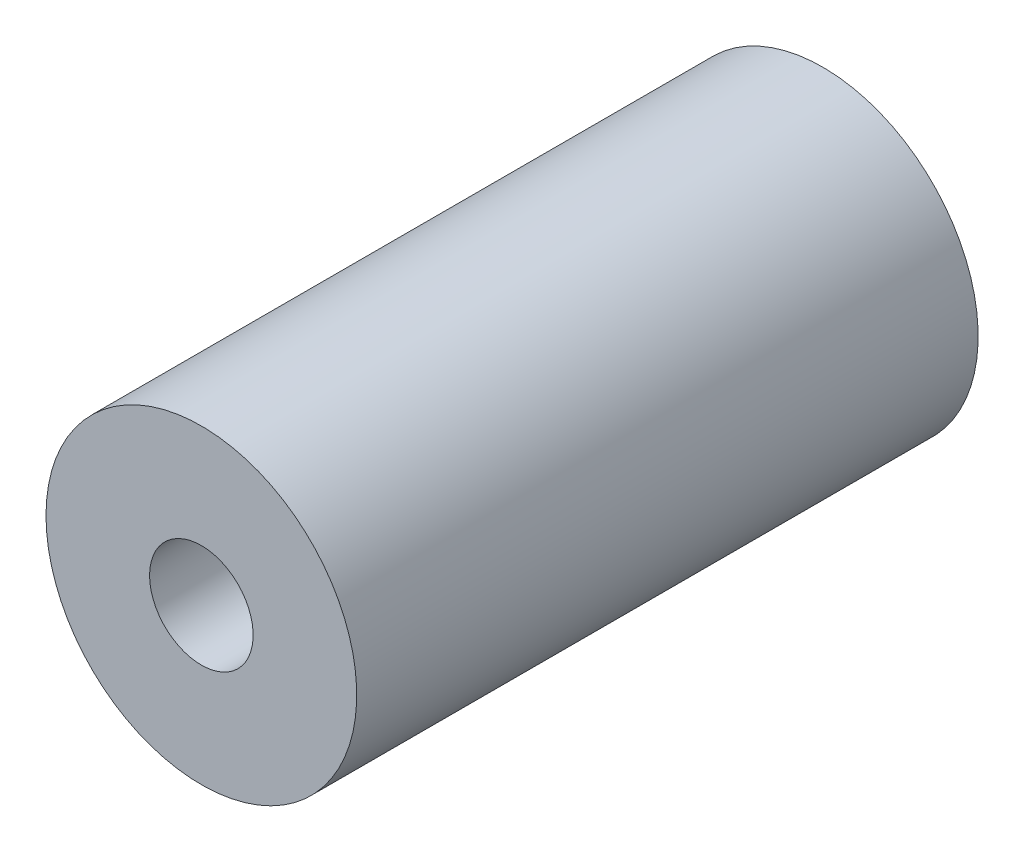
ISO-10303-21;
HEADER;
FILE_DESCRIPTION(('STEP AP214'),'2;1');
FILE_NAME('part.step','',(''),(''),'','','');
FILE_SCHEMA(('AUTOMOTIVE_DESIGN { 1 0 10303 214 1 1 1 1 }'));
ENDSEC;
DATA;
#1=APPLICATION_CONTEXT('core data for automotive mechanical design processes');
#2=APPLICATION_PROTOCOL_DEFINITION('international standard','automotive_design',2000,#1);
#3=PRODUCT_CONTEXT('',#1,'mechanical');
#4=PRODUCT('Part','Part','',(#3));
#5=PRODUCT_RELATED_PRODUCT_CATEGORY('part','',(#4));
#6=PRODUCT_DEFINITION_FORMATION('','',#4);
#7=PRODUCT_DEFINITION_CONTEXT('part definition',#1,'design');
#8=PRODUCT_DEFINITION('design','',#6,#7);
#9=PRODUCT_DEFINITION_SHAPE('','',#8);
#10=(LENGTH_UNIT() NAMED_UNIT(*) SI_UNIT(.MILLI.,.METRE.));
#11=(NAMED_UNIT(*) PLANE_ANGLE_UNIT() SI_UNIT($,.RADIAN.));
#12=(NAMED_UNIT(*) SI_UNIT($,.STERADIAN.) SOLID_ANGLE_UNIT());
#13=UNCERTAINTY_MEASURE_WITH_UNIT(LENGTH_MEASURE(1.E-05),#10,'distance_accuracy_value','');
#14=(GEOMETRIC_REPRESENTATION_CONTEXT(3) GLOBAL_UNCERTAINTY_ASSIGNED_CONTEXT((#13)) GLOBAL_UNIT_ASSIGNED_CONTEXT((#10,
#11,#12)) REPRESENTATION_CONTEXT('',''));
#15=CARTESIAN_POINT('',(0.,0.,0.));
#16=DIRECTION('',(0.,0.,1.));
#17=DIRECTION('',(1.,0.,0.));
#18=AXIS2_PLACEMENT_3D('',#15,#16,#17);
#19=CARTESIAN_POINT('',(0.,0.,38.1));
#20=DIRECTION('',(0.,0.,1.));
#21=DIRECTION('',(1.,0.,0.));
#22=AXIS2_PLACEMENT_3D('',#19,#20,#21);
#23=PLANE('',#22);
#24=CARTESIAN_POINT('',(0.,0.,38.1));
#25=DIRECTION('',(0.,0.,1.));
#26=DIRECTION('',(1.,0.,0.));
#27=AXIS2_PLACEMENT_3D('',#24,#25,#26);
#28=CIRCLE('',#27,9.525);
#29=CARTESIAN_POINT('',(-9.525,0.,38.1));
#30=VERTEX_POINT('',#29);
#31=EDGE_CURVE('E10',#30,#30,#28,.T.);
#32=ORIENTED_EDGE('',*,*,#31,.T.);
#33=EDGE_LOOP('',(#32));
#34=FACE_BOUND('',#33,.T.);
#35=CARTESIAN_POINT('',(0.,0.,38.1));
#36=DIRECTION('',(0.,0.,1.));
#37=DIRECTION('',(1.,0.,0.));
#38=AXIS2_PLACEMENT_3D('',#35,#36,#37);
#39=CIRCLE('',#38,3.175);
#40=CARTESIAN_POINT('',(-3.175,0.,38.1));
#41=VERTEX_POINT('',#40);
#42=EDGE_CURVE('E44',#41,#41,#39,.T.);
#43=ORIENTED_EDGE('',*,*,#42,.F.);
#44=EDGE_LOOP('',(#43));
#45=FACE_BOUND('',#44,.T.);
#46=ADVANCED_FACE('F33',(#34,#45),#23,.T.);
#47=CARTESIAN_POINT('',(0.,0.,0.));
#48=DIRECTION('',(0.,0.,1.));
#49=DIRECTION('',(1.,0.,0.));
#50=AXIS2_PLACEMENT_3D('',#47,#48,#49);
#51=PLANE('',#50);
#52=CARTESIAN_POINT('',(0.,0.,0.));
#53=DIRECTION('',(0.,0.,1.));
#54=DIRECTION('',(1.,0.,0.));
#55=AXIS2_PLACEMENT_3D('',#52,#53,#54);
#56=CIRCLE('',#55,9.525);
#57=CARTESIAN_POINT('',(-9.525,0.,0.));
#58=VERTEX_POINT('',#57);
#59=EDGE_CURVE('E37',#58,#58,#56,.T.);
#60=ORIENTED_EDGE('',*,*,#59,.F.);
#61=EDGE_LOOP('',(#60));
#62=FACE_BOUND('',#61,.T.);
#63=CARTESIAN_POINT('',(0.,0.,0.));
#64=DIRECTION('',(0.,0.,1.));
#65=DIRECTION('',(1.,0.,0.));
#66=AXIS2_PLACEMENT_3D('',#63,#64,#65);
#67=CIRCLE('',#66,3.175);
#68=CARTESIAN_POINT('',(-3.175,0.,0.));
#69=VERTEX_POINT('',#68);
#70=EDGE_CURVE('E46',#69,#69,#67,.T.);
#71=ORIENTED_EDGE('',*,*,#70,.T.);
#72=EDGE_LOOP('',(#71));
#73=FACE_BOUND('',#72,.T.);
#74=ADVANCED_FACE('F56',(#62,#73),#51,.F.);
#75=CARTESIAN_POINT('',(0.,0.,38.1));
#76=DIRECTION('',(0.,0.,-1.));
#77=DIRECTION('',(-1.,0.,0.));
#78=AXIS2_PLACEMENT_3D('',#75,#76,#77);
#79=CYLINDRICAL_SURFACE('',#78,9.525);
#80=CARTESIAN_POINT('',(-9.525,0.,38.1));
#81=CARTESIAN_POINT('',(-9.525,0.,37.703125));
#82=CARTESIAN_POINT('',(-9.525,0.,37.30625));
#83=CARTESIAN_POINT('',(-9.525,0.,36.5125));
#84=CARTESIAN_POINT('',(-9.525,0.,36.115625));
#85=CARTESIAN_POINT('',(-9.525,0.,35.321875));
#86=CARTESIAN_POINT('',(-9.525,0.,34.925));
#87=CARTESIAN_POINT('',(-9.525,0.,34.13125));
#88=CARTESIAN_POINT('',(-9.525,0.,33.734375));
#89=CARTESIAN_POINT('',(-9.525,0.,32.940625));
#90=CARTESIAN_POINT('',(-9.525,0.,32.54375));
#91=CARTESIAN_POINT('',(-9.525,0.,31.75));
#92=CARTESIAN_POINT('',(-9.525,0.,31.353125));
#93=CARTESIAN_POINT('',(-9.525,0.,30.559375));
#94=CARTESIAN_POINT('',(-9.525,0.,30.1625));
#95=CARTESIAN_POINT('',(-9.525,0.,29.36875));
#96=CARTESIAN_POINT('',(-9.525,0.,28.971875));
#97=CARTESIAN_POINT('',(-9.525,0.,28.178125));
#98=CARTESIAN_POINT('',(-9.525,0.,27.78125));
#99=CARTESIAN_POINT('',(-9.525,0.,26.9875));
#100=CARTESIAN_POINT('',(-9.525,0.,26.590625));
#101=CARTESIAN_POINT('',(-9.525,0.,25.796875));
#102=CARTESIAN_POINT('',(-9.525,0.,25.4));
#103=CARTESIAN_POINT('',(-9.525,0.,24.60625));
#104=CARTESIAN_POINT('',(-9.525,0.,24.209375));
#105=CARTESIAN_POINT('',(-9.525,0.,23.415625));
#106=CARTESIAN_POINT('',(-9.525,0.,23.01875));
#107=CARTESIAN_POINT('',(-9.525,0.,22.225));
#108=CARTESIAN_POINT('',(-9.525,0.,21.828125));
#109=CARTESIAN_POINT('',(-9.525,0.,21.034375));
#110=CARTESIAN_POINT('',(-9.525,0.,20.6375));
#111=CARTESIAN_POINT('',(-9.525,0.,19.84375));
#112=CARTESIAN_POINT('',(-9.525,0.,19.446875));
#113=CARTESIAN_POINT('',(-9.525,0.,18.653125));
#114=CARTESIAN_POINT('',(-9.525,0.,18.25625));
#115=CARTESIAN_POINT('',(-9.525,0.,17.4625));
#116=CARTESIAN_POINT('',(-9.525,0.,17.065625));
#117=CARTESIAN_POINT('',(-9.525,0.,16.271875));
#118=CARTESIAN_POINT('',(-9.525,0.,15.875));
#119=CARTESIAN_POINT('',(-9.525,0.,15.08125));
#120=CARTESIAN_POINT('',(-9.525,0.,14.684375));
#121=CARTESIAN_POINT('',(-9.525,0.,13.890625));
#122=CARTESIAN_POINT('',(-9.525,0.,13.49375));
#123=CARTESIAN_POINT('',(-9.525,0.,12.7));
#124=CARTESIAN_POINT('',(-9.525,0.,12.303125));
#125=CARTESIAN_POINT('',(-9.525,0.,11.509375));
#126=CARTESIAN_POINT('',(-9.525,0.,11.1125));
#127=CARTESIAN_POINT('',(-9.525,0.,10.31875));
#128=CARTESIAN_POINT('',(-9.525,0.,9.92187499999999));
#129=CARTESIAN_POINT('',(-9.525,0.,9.128125));
#130=CARTESIAN_POINT('',(-9.525,0.,8.73124999999999));
#131=CARTESIAN_POINT('',(-9.525,0.,7.93749999999999));
#132=CARTESIAN_POINT('',(-9.525,0.,7.54062499999999));
#133=CARTESIAN_POINT('',(-9.525,0.,6.746875));
#134=CARTESIAN_POINT('',(-9.525,0.,6.35));
#135=CARTESIAN_POINT('',(-9.525,0.,5.55625));
#136=CARTESIAN_POINT('',(-9.525,0.,5.159375));
#137=CARTESIAN_POINT('',(-9.525,0.,4.365625));
#138=CARTESIAN_POINT('',(-9.525,0.,3.96875));
#139=CARTESIAN_POINT('',(-9.525,0.,3.175));
#140=CARTESIAN_POINT('',(-9.525,0.,2.778125));
#141=CARTESIAN_POINT('',(-9.525,0.,1.984375));
#142=CARTESIAN_POINT('',(-9.525,0.,1.5875));
#143=CARTESIAN_POINT('',(-9.525,0.,0.79375));
#144=CARTESIAN_POINT('',(-9.525,0.,0.396875));
#145=CARTESIAN_POINT('',(-9.525,0.,0.));
#146=B_SPLINE_CURVE_WITH_KNOTS('',3,(#80,#81,#82,#83,#84,#85,#86,#87,#88,#89,#90,#91,#92,#93,
#94,#95,#96,#97,#98,#99,#100,#101,#102,#103,#104,#105,#106,#107,#108,#109,#110,#111,#112,#113,
#114,#115,#116,#117,#118,#119,#120,#121,#122,#123,#124,#125,#126,#127,#128,#129,#130,#131,#132,
#133,#134,#135,#136,#137,#138,#139,#140,#141,#142,#143,#144,#145),.UNSPECIFIED.,.F.,.F.,(4,2,2,
2,2,2,2,2,2,2,2,2,2,2,2,2,2,2,2,2,2,2,2,2,2,2,2,2,2,2,2,2,4),(0.,1.190625,2.38125,3.571875,
4.7625,5.953125,7.14375,8.334375,9.52500000000001,10.715625,11.90625,13.096875,14.2875,
15.478125,16.66875,17.859375,19.05,20.240625,21.43125,22.621875,23.8125,25.003125,26.19375,
27.384375,28.575,29.765625,30.95625,32.146875,33.3375,34.528125,35.71875,36.909375,38.1),.UNSPECIFIED.);
#147=EDGE_CURVE('BSEAM35',#30,#58,#146,.T.);
#148=ORIENTED_EDGE('',*,*,#31,.F.);
#149=ORIENTED_EDGE('',*,*,#59,.T.);
#150=ORIENTED_EDGE('',*,*,#147,.T.);
#151=ORIENTED_EDGE('',*,*,#147,.F.);
#152=EDGE_LOOP('',(#148,#150,#149,#151));
#153=FACE_BOUND('',#152,.T.);
#154=ADVANCED_FACE('F35',(#153),#79,.T.);
#155=CARTESIAN_POINT('',(0.,0.,38.1));
#156=DIRECTION('',(0.,0.,-1.));
#157=DIRECTION('',(-1.,0.,0.));
#158=AXIS2_PLACEMENT_3D('',#155,#156,#157);
#159=CYLINDRICAL_SURFACE('',#158,3.175);
#160=CARTESIAN_POINT('',(-3.175,0.,38.1));
#161=CARTESIAN_POINT('',(-3.175,0.,37.703125));
#162=CARTESIAN_POINT('',(-3.175,0.,37.30625));
#163=CARTESIAN_POINT('',(-3.175,0.,36.5125));
#164=CARTESIAN_POINT('',(-3.175,0.,36.115625));
#165=CARTESIAN_POINT('',(-3.175,0.,35.321875));
#166=CARTESIAN_POINT('',(-3.175,0.,34.925));
#167=CARTESIAN_POINT('',(-3.175,0.,34.13125));
#168=CARTESIAN_POINT('',(-3.175,0.,33.734375));
#169=CARTESIAN_POINT('',(-3.175,0.,32.940625));
#170=CARTESIAN_POINT('',(-3.175,0.,32.54375));
#171=CARTESIAN_POINT('',(-3.175,0.,31.75));
#172=CARTESIAN_POINT('',(-3.175,0.,31.353125));
#173=CARTESIAN_POINT('',(-3.175,0.,30.559375));
#174=CARTESIAN_POINT('',(-3.175,0.,30.1625));
#175=CARTESIAN_POINT('',(-3.175,0.,29.36875));
#176=CARTESIAN_POINT('',(-3.175,0.,28.971875));
#177=CARTESIAN_POINT('',(-3.175,0.,28.178125));
#178=CARTESIAN_POINT('',(-3.175,0.,27.78125));
#179=CARTESIAN_POINT('',(-3.175,0.,26.9875));
#180=CARTESIAN_POINT('',(-3.175,0.,26.590625));
#181=CARTESIAN_POINT('',(-3.175,0.,25.796875));
#182=CARTESIAN_POINT('',(-3.175,0.,25.4));
#183=CARTESIAN_POINT('',(-3.175,0.,24.60625));
#184=CARTESIAN_POINT('',(-3.175,0.,24.209375));
#185=CARTESIAN_POINT('',(-3.175,0.,23.415625));
#186=CARTESIAN_POINT('',(-3.175,0.,23.01875));
#187=CARTESIAN_POINT('',(-3.175,0.,22.225));
#188=CARTESIAN_POINT('',(-3.175,0.,21.828125));
#189=CARTESIAN_POINT('',(-3.175,0.,21.034375));
#190=CARTESIAN_POINT('',(-3.175,0.,20.6375));
#191=CARTESIAN_POINT('',(-3.175,0.,19.84375));
#192=CARTESIAN_POINT('',(-3.175,0.,19.446875));
#193=CARTESIAN_POINT('',(-3.175,0.,18.653125));
#194=CARTESIAN_POINT('',(-3.175,0.,18.25625));
#195=CARTESIAN_POINT('',(-3.175,0.,17.4625));
#196=CARTESIAN_POINT('',(-3.175,0.,17.065625));
#197=CARTESIAN_POINT('',(-3.175,0.,16.271875));
#198=CARTESIAN_POINT('',(-3.175,0.,15.875));
#199=CARTESIAN_POINT('',(-3.175,0.,15.08125));
#200=CARTESIAN_POINT('',(-3.175,0.,14.684375));
#201=CARTESIAN_POINT('',(-3.175,0.,13.890625));
#202=CARTESIAN_POINT('',(-3.175,0.,13.49375));
#203=CARTESIAN_POINT('',(-3.175,0.,12.7));
#204=CARTESIAN_POINT('',(-3.175,0.,12.303125));
#205=CARTESIAN_POINT('',(-3.175,0.,11.509375));
#206=CARTESIAN_POINT('',(-3.175,0.,11.1125));
#207=CARTESIAN_POINT('',(-3.175,0.,10.31875));
#208=CARTESIAN_POINT('',(-3.175,0.,9.921875));
#209=CARTESIAN_POINT('',(-3.175,0.,9.128125));
#210=CARTESIAN_POINT('',(-3.175,0.,8.73125));
#211=CARTESIAN_POINT('',(-3.175,0.,7.9375));
#212=CARTESIAN_POINT('',(-3.175,0.,7.540625));
#213=CARTESIAN_POINT('',(-3.175,0.,6.746875));
#214=CARTESIAN_POINT('',(-3.175,0.,6.35));
#215=CARTESIAN_POINT('',(-3.175,0.,5.55625));
#216=CARTESIAN_POINT('',(-3.175,0.,5.159375));
#217=CARTESIAN_POINT('',(-3.175,0.,4.365625));
#218=CARTESIAN_POINT('',(-3.175,0.,3.96875));
#219=CARTESIAN_POINT('',(-3.175,0.,3.175));
#220=CARTESIAN_POINT('',(-3.175,0.,2.778125));
#221=CARTESIAN_POINT('',(-3.175,0.,1.984375));
#222=CARTESIAN_POINT('',(-3.175,0.,1.5875));
#223=CARTESIAN_POINT('',(-3.175,0.,0.79375));
#224=CARTESIAN_POINT('',(-3.175,0.,0.396875));
#225=CARTESIAN_POINT('',(-3.175,0.,0.));
#226=B_SPLINE_CURVE_WITH_KNOTS('',3,(#160,#161,#162,#163,#164,#165,#166,#167,#168,#169,#170,
#171,#172,#173,#174,#175,#176,#177,#178,#179,#180,#181,#182,#183,#184,#185,#186,#187,#188,#189,
#190,#191,#192,#193,#194,#195,#196,#197,#198,#199,#200,#201,#202,#203,#204,#205,#206,#207,#208,
#209,#210,#211,#212,#213,#214,#215,#216,#217,#218,#219,#220,#221,#222,#223,#224,#225),
.UNSPECIFIED.,.F.,.F.,(4,2,2,2,2,2,2,2,2,2,2,2,2,2,2,2,2,2,2,2,2,2,2,2,2,2,2,2,2,2,2,2,4),(0.,
1.19062499999999,2.38124999999999,3.571875,4.7625,5.953125,7.14375,8.33437499999999,9.525,
10.715625,11.90625,13.096875,14.2875,15.478125,16.66875,17.859375,19.05,20.240625,21.43125,
22.621875,23.8125,25.003125,26.19375,27.384375,28.575,29.765625,30.95625,32.146875,33.3375,
34.528125,35.71875,36.909375,38.1),.UNSPECIFIED.);
#227=EDGE_CURVE('BSEAM52',#41,#69,#226,.T.);
#228=ORIENTED_EDGE('',*,*,#42,.T.);
#229=ORIENTED_EDGE('',*,*,#70,.F.);
#230=ORIENTED_EDGE('',*,*,#227,.T.);
#231=ORIENTED_EDGE('',*,*,#227,.F.);
#232=EDGE_LOOP('',(#228,#230,#229,#231));
#233=FACE_BOUND('',#232,.T.);
#234=ADVANCED_FACE('F52',(#233),#159,.F.);
#235=CLOSED_SHELL('',(#46,#74,#154,#234));
#236=MANIFOLD_SOLID_BREP('B2',#235);
#237=ADVANCED_BREP_SHAPE_REPRESENTATION('',(#18,#236),#14);
#238=SHAPE_DEFINITION_REPRESENTATION(#9,#237);
ENDSEC;
END-ISO-10303-21;
